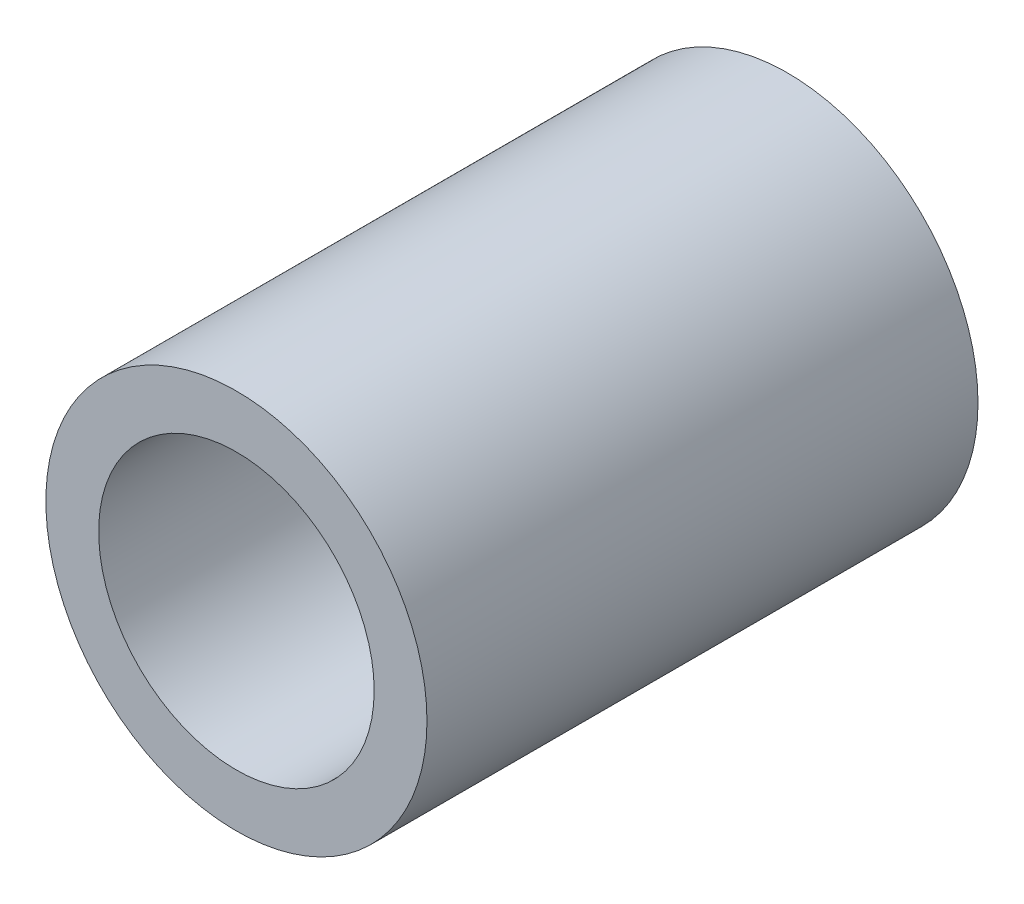
ISO-10303-21;
HEADER;
FILE_DESCRIPTION(('STEP AP214'),'2;1');
FILE_NAME('part.step','',(''),(''),'','','');
FILE_SCHEMA(('AUTOMOTIVE_DESIGN { 1 0 10303 214 1 1 1 1 }'));
ENDSEC;
DATA;
#1=APPLICATION_CONTEXT('core data for automotive mechanical design processes');
#2=APPLICATION_PROTOCOL_DEFINITION('international standard','automotive_design',2000,#1);
#3=PRODUCT_CONTEXT('',#1,'mechanical');
#4=PRODUCT('Part','Part','',(#3));
#5=PRODUCT_RELATED_PRODUCT_CATEGORY('part','',(#4));
#6=PRODUCT_DEFINITION_FORMATION('','',#4);
#7=PRODUCT_DEFINITION_CONTEXT('part definition',#1,'design');
#8=PRODUCT_DEFINITION('design','',#6,#7);
#9=PRODUCT_DEFINITION_SHAPE('','',#8);
#10=(LENGTH_UNIT() NAMED_UNIT(*) SI_UNIT(.MILLI.,.METRE.));
#11=(NAMED_UNIT(*) PLANE_ANGLE_UNIT() SI_UNIT($,.RADIAN.));
#12=(NAMED_UNIT(*) SI_UNIT($,.STERADIAN.) SOLID_ANGLE_UNIT());
#13=UNCERTAINTY_MEASURE_WITH_UNIT(LENGTH_MEASURE(1.E-05),#10,'distance_accuracy_value','');
#14=(GEOMETRIC_REPRESENTATION_CONTEXT(3) GLOBAL_UNCERTAINTY_ASSIGNED_CONTEXT((#13)) GLOBAL_UNIT_ASSIGNED_CONTEXT((#10,
#11,#12)) REPRESENTATION_CONTEXT('',''));
#15=CARTESIAN_POINT('',(0.,0.,0.));
#16=DIRECTION('',(0.,0.,1.));
#17=DIRECTION('',(1.,0.,0.));
#18=AXIS2_PLACEMENT_3D('',#15,#16,#17);
#19=CARTESIAN_POINT('',(0.,0.,120.));
#20=DIRECTION('',(0.,0.,1.));
#21=DIRECTION('',(1.,0.,0.));
#22=AXIS2_PLACEMENT_3D('',#19,#20,#21);
#23=PLANE('',#22);
#24=CARTESIAN_POINT('',(0.,0.,120.));
#25=DIRECTION('',(0.,0.,1.));
#26=DIRECTION('',(1.,0.,0.));
#27=AXIS2_PLACEMENT_3D('',#24,#25,#26);
#28=CIRCLE('',#27,41.5);
#29=CARTESIAN_POINT('',(41.5,0.,120.));
#30=VERTEX_POINT('',#29);
#31=EDGE_CURVE('E10',#30,#30,#28,.T.);
#32=ORIENTED_EDGE('',*,*,#31,.T.);
#33=EDGE_LOOP('',(#32));
#34=FACE_BOUND('',#33,.T.);
#35=CARTESIAN_POINT('',(0.,0.,120.));
#36=DIRECTION('',(0.,0.,1.));
#37=DIRECTION('',(1.,0.,0.));
#38=AXIS2_PLACEMENT_3D('',#35,#36,#37);
#39=CIRCLE('',#38,30.);
#40=CARTESIAN_POINT('',(30.,0.,120.));
#41=VERTEX_POINT('',#40);
#42=EDGE_CURVE('E48',#41,#41,#39,.T.);
#43=ORIENTED_EDGE('',*,*,#42,.F.);
#44=EDGE_LOOP('',(#43));
#45=FACE_BOUND('',#44,.T.);
#46=ADVANCED_FACE('F37',(#34,#45),#23,.T.);
#47=CARTESIAN_POINT('',(0.,0.,0.));
#48=DIRECTION('',(0.,0.,1.));
#49=DIRECTION('',(1.,0.,0.));
#50=AXIS2_PLACEMENT_3D('',#47,#48,#49);
#51=PLANE('',#50);
#52=CARTESIAN_POINT('',(0.,0.,0.));
#53=DIRECTION('',(0.,0.,1.));
#54=DIRECTION('',(1.,0.,0.));
#55=AXIS2_PLACEMENT_3D('',#52,#53,#54);
#56=CIRCLE('',#55,41.5);
#57=CARTESIAN_POINT('',(41.5,0.,0.));
#58=VERTEX_POINT('',#57);
#59=EDGE_CURVE('E41',#58,#58,#56,.T.);
#60=ORIENTED_EDGE('',*,*,#59,.F.);
#61=EDGE_LOOP('',(#60));
#62=FACE_BOUND('',#61,.T.);
#63=CARTESIAN_POINT('',(0.,0.,0.));
#64=DIRECTION('',(0.,0.,1.));
#65=DIRECTION('',(1.,0.,0.));
#66=AXIS2_PLACEMENT_3D('',#63,#64,#65);
#67=CIRCLE('',#66,30.);
#68=CARTESIAN_POINT('',(30.,0.,0.));
#69=VERTEX_POINT('',#68);
#70=EDGE_CURVE('E50',#69,#69,#67,.T.);
#71=ORIENTED_EDGE('',*,*,#70,.T.);
#72=EDGE_LOOP('',(#71));
#73=FACE_BOUND('',#72,.T.);
#74=ADVANCED_FACE('F60',(#62,#73),#51,.F.);
#75=CARTESIAN_POINT('',(0.,0.,120.));
#76=DIRECTION('',(0.,0.,-1.));
#77=DIRECTION('',(-1.,0.,0.));
#78=AXIS2_PLACEMENT_3D('',#75,#76,#77);
#79=CYLINDRICAL_SURFACE('',#78,41.5);
#80=ORIENTED_EDGE('',*,*,#31,.F.);
#81=EDGE_LOOP('',(#80));
#82=FACE_BOUND('',#81,.T.);
#83=ORIENTED_EDGE('',*,*,#59,.T.);
#84=EDGE_LOOP('',(#83));
#85=FACE_BOUND('',#84,.T.);
#86=ADVANCED_FACE('F39',(#82,#85),#79,.T.);
#87=CARTESIAN_POINT('',(0.,0.,120.));
#88=DIRECTION('',(0.,0.,-1.));
#89=DIRECTION('',(-1.,0.,0.));
#90=AXIS2_PLACEMENT_3D('',#87,#88,#89);
#91=CYLINDRICAL_SURFACE('',#90,30.);
#92=ORIENTED_EDGE('',*,*,#42,.T.);
#93=EDGE_LOOP('',(#92));
#94=FACE_BOUND('',#93,.T.);
#95=ORIENTED_EDGE('',*,*,#70,.F.);
#96=EDGE_LOOP('',(#95));
#97=FACE_BOUND('',#96,.T.);
#98=ADVANCED_FACE('F56',(#94,#97),#91,.F.);
#99=CLOSED_SHELL('',(#46,#74,#86,#98));
#100=MANIFOLD_SOLID_BREP('B2',#99);
#101=ADVANCED_BREP_SHAPE_REPRESENTATION('',(#18,#100),#14);
#102=SHAPE_DEFINITION_REPRESENTATION(#9,#101);
ENDSEC;
END-ISO-10303-21;
